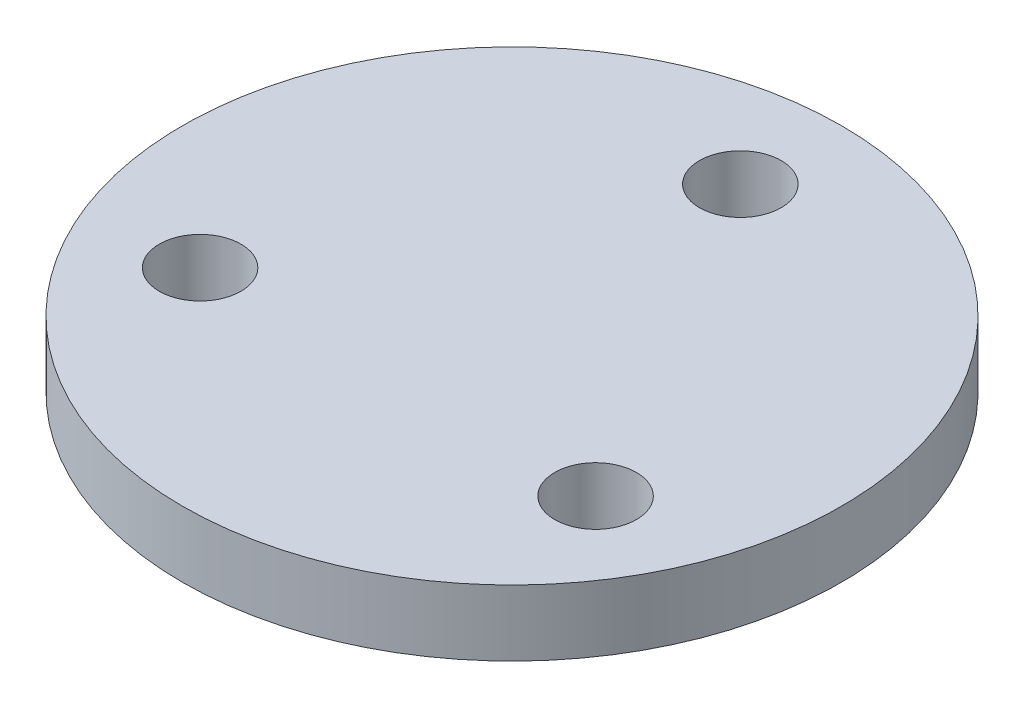
ISO-10303-21;
HEADER;
FILE_DESCRIPTION(('STEP AP214'),'2;1');
FILE_NAME('part.step','',(''),(''),'','','');
FILE_SCHEMA(('AUTOMOTIVE_DESIGN { 1 0 10303 214 1 1 1 1 }'));
ENDSEC;
DATA;
#1=APPLICATION_CONTEXT('core data for automotive mechanical design processes');
#2=APPLICATION_PROTOCOL_DEFINITION('international standard','automotive_design',2000,#1);
#3=PRODUCT_CONTEXT('',#1,'mechanical');
#4=PRODUCT('Part','Part','',(#3));
#5=PRODUCT_RELATED_PRODUCT_CATEGORY('part','',(#4));
#6=PRODUCT_DEFINITION_FORMATION('','',#4);
#7=PRODUCT_DEFINITION_CONTEXT('part definition',#1,'design');
#8=PRODUCT_DEFINITION('design','',#6,#7);
#9=PRODUCT_DEFINITION_SHAPE('','',#8);
#10=(LENGTH_UNIT() NAMED_UNIT(*) SI_UNIT(.MILLI.,.METRE.));
#11=(NAMED_UNIT(*) PLANE_ANGLE_UNIT() SI_UNIT($,.RADIAN.));
#12=(NAMED_UNIT(*) SI_UNIT($,.STERADIAN.) SOLID_ANGLE_UNIT());
#13=UNCERTAINTY_MEASURE_WITH_UNIT(LENGTH_MEASURE(1.E-05),#10,'distance_accuracy_value','');
#14=(GEOMETRIC_REPRESENTATION_CONTEXT(3) GLOBAL_UNCERTAINTY_ASSIGNED_CONTEXT((#13)) GLOBAL_UNIT_ASSIGNED_CONTEXT((#10,
#11,#12)) REPRESENTATION_CONTEXT('',''));
#15=CARTESIAN_POINT('',(0.,0.,0.));
#16=DIRECTION('',(0.,0.,1.));
#17=DIRECTION('',(1.,0.,0.));
#18=AXIS2_PLACEMENT_3D('',#15,#16,#17);
#19=CARTESIAN_POINT('',(0.,6.35,0.));
#20=DIRECTION('',(0.,1.,0.));
#21=DIRECTION('',(0.,0.,1.));
#22=AXIS2_PLACEMENT_3D('',#19,#20,#21);
#23=PLANE('',#22);
#24=CARTESIAN_POINT('',(19.0499999999999,6.35,10.9985226280624));
#25=DIRECTION('',(0.,1.,0.));
#26=DIRECTION('',(0.,0.,1.));
#27=AXIS2_PLACEMENT_3D('',#24,#25,#26);
#28=CIRCLE('',#27,3.937);
#29=CARTESIAN_POINT('',(19.0499999999999,6.35,14.9355226280624));
#30=VERTEX_POINT('',#29);
#31=EDGE_CURVE('E47',#30,#30,#28,.T.);
#32=ORIENTED_EDGE('',*,*,#31,.F.);
#33=EDGE_LOOP('',(#32));
#34=FACE_BOUND('',#33,.T.);
#35=CARTESIAN_POINT('',(0.,6.35,0.));
#36=DIRECTION('',(0.,1.,0.));
#37=DIRECTION('',(0.,0.,1.));
#38=AXIS2_PLACEMENT_3D('',#35,#36,#37);
#39=CIRCLE('',#38,31.75);
#40=CARTESIAN_POINT('',(0.,6.35,31.75));
#41=VERTEX_POINT('',#40);
#42=EDGE_CURVE('E10',#41,#41,#39,.T.);
#43=ORIENTED_EDGE('',*,*,#42,.T.);
#44=EDGE_LOOP('',(#43));
#45=FACE_BOUND('',#44,.T.);
#46=CARTESIAN_POINT('',(0.,6.35,-21.9970452561247));
#47=DIRECTION('',(0.,1.,0.));
#48=DIRECTION('',(0.,0.,1.));
#49=AXIS2_PLACEMENT_3D('',#46,#47,#48);
#50=CIRCLE('',#49,3.937);
#51=CARTESIAN_POINT('',(0.,6.35,-18.0600452561247));
#52=VERTEX_POINT('',#51);
#53=EDGE_CURVE('E42',#52,#52,#50,.T.);
#54=ORIENTED_EDGE('',*,*,#53,.F.);
#55=EDGE_LOOP('',(#54));
#56=FACE_BOUND('',#55,.T.);
#57=CARTESIAN_POINT('',(-19.0500000000001,6.35,10.9985226280622));
#58=DIRECTION('',(0.,1.,0.));
#59=DIRECTION('',(0.,0.,1.));
#60=AXIS2_PLACEMENT_3D('',#57,#58,#59);
#61=CIRCLE('',#60,3.937);
#62=CARTESIAN_POINT('',(-19.0500000000001,6.35,14.9355226280622));
#63=VERTEX_POINT('',#62);
#64=EDGE_CURVE('E53',#63,#63,#61,.T.);
#65=ORIENTED_EDGE('',*,*,#64,.F.);
#66=EDGE_LOOP('',(#65));
#67=FACE_BOUND('',#66,.T.);
#68=ADVANCED_FACE('F31',(#34,#45,#56,#67),#23,.T.);
#69=CARTESIAN_POINT('',(0.,0.,0.));
#70=DIRECTION('',(0.,1.,0.));
#71=DIRECTION('',(0.,0.,1.));
#72=AXIS2_PLACEMENT_3D('',#69,#70,#71);
#73=PLANE('',#72);
#74=CARTESIAN_POINT('',(0.,0.,0.));
#75=DIRECTION('',(0.,1.,0.));
#76=DIRECTION('',(0.,0.,1.));
#77=AXIS2_PLACEMENT_3D('',#74,#75,#76);
#78=CIRCLE('',#77,31.75);
#79=CARTESIAN_POINT('',(0.,0.,31.75));
#80=VERTEX_POINT('',#79);
#81=EDGE_CURVE('E35',#80,#80,#78,.T.);
#82=ORIENTED_EDGE('',*,*,#81,.F.);
#83=EDGE_LOOP('',(#82));
#84=FACE_BOUND('',#83,.T.);
#85=CARTESIAN_POINT('',(0.,0.,-21.9970452561247));
#86=DIRECTION('',(0.,1.,0.));
#87=DIRECTION('',(0.,0.,1.));
#88=AXIS2_PLACEMENT_3D('',#85,#86,#87);
#89=CIRCLE('',#88,3.937);
#90=CARTESIAN_POINT('',(0.,0.,-18.0600452561247));
#91=VERTEX_POINT('',#90);
#92=EDGE_CURVE('E44',#91,#91,#89,.T.);
#93=ORIENTED_EDGE('',*,*,#92,.T.);
#94=EDGE_LOOP('',(#93));
#95=FACE_BOUND('',#94,.T.);
#96=CARTESIAN_POINT('',(19.0499999999999,0.,10.9985226280624));
#97=DIRECTION('',(0.,1.,0.));
#98=DIRECTION('',(0.,0.,1.));
#99=AXIS2_PLACEMENT_3D('',#96,#97,#98);
#100=CIRCLE('',#99,3.937);
#101=CARTESIAN_POINT('',(19.0499999999999,0.,14.9355226280624));
#102=VERTEX_POINT('',#101);
#103=EDGE_CURVE('E50',#102,#102,#100,.T.);
#104=ORIENTED_EDGE('',*,*,#103,.T.);
#105=EDGE_LOOP('',(#104));
#106=FACE_BOUND('',#105,.T.);
#107=CARTESIAN_POINT('',(-19.0500000000001,0.,10.9985226280622));
#108=DIRECTION('',(0.,1.,0.));
#109=DIRECTION('',(0.,0.,1.));
#110=AXIS2_PLACEMENT_3D('',#107,#108,#109);
#111=CIRCLE('',#110,3.937);
#112=CARTESIAN_POINT('',(-19.0500000000001,0.,14.9355226280622));
#113=VERTEX_POINT('',#112);
#114=EDGE_CURVE('E56',#113,#113,#111,.T.);
#115=ORIENTED_EDGE('',*,*,#114,.T.);
#116=EDGE_LOOP('',(#115));
#117=FACE_BOUND('',#116,.T.);
#118=ADVANCED_FACE('F66',(#84,#95,#106,#117),#73,.F.);
#119=CARTESIAN_POINT('',(0.,6.35,0.));
#120=DIRECTION('',(0.,-1.,0.));
#121=DIRECTION('',(0.,0.,-1.));
#122=AXIS2_PLACEMENT_3D('',#119,#120,#121);
#123=CYLINDRICAL_SURFACE('',#122,31.75);
#124=ORIENTED_EDGE('',*,*,#42,.F.);
#125=EDGE_LOOP('',(#124));
#126=FACE_BOUND('',#125,.T.);
#127=ORIENTED_EDGE('',*,*,#81,.T.);
#128=EDGE_LOOP('',(#127));
#129=FACE_BOUND('',#128,.T.);
#130=ADVANCED_FACE('F33',(#126,#129),#123,.T.);
#131=CARTESIAN_POINT('',(0.,6.35,-21.9970452561247));
#132=DIRECTION('',(0.,-1.,0.));
#133=DIRECTION('',(0.,0.,-1.));
#134=AXIS2_PLACEMENT_3D('',#131,#132,#133);
#135=CYLINDRICAL_SURFACE('',#134,3.937);
#136=ORIENTED_EDGE('',*,*,#53,.T.);
#137=EDGE_LOOP('',(#136));
#138=FACE_BOUND('',#137,.T.);
#139=ORIENTED_EDGE('',*,*,#92,.F.);
#140=EDGE_LOOP('',(#139));
#141=FACE_BOUND('',#140,.T.);
#142=ADVANCED_FACE('F75',(#138,#141),#135,.F.);
#143=CARTESIAN_POINT('',(19.0499999999999,6.35,10.9985226280624));
#144=DIRECTION('',(0.,-1.,0.));
#145=DIRECTION('',(0.,0.,-1.));
#146=AXIS2_PLACEMENT_3D('',#143,#144,#145);
#147=CYLINDRICAL_SURFACE('',#146,3.937);
#148=ORIENTED_EDGE('',*,*,#31,.T.);
#149=EDGE_LOOP('',(#148));
#150=FACE_BOUND('',#149,.T.);
#151=ORIENTED_EDGE('',*,*,#103,.F.);
#152=EDGE_LOOP('',(#151));
#153=FACE_BOUND('',#152,.T.);
#154=ADVANCED_FACE('F78',(#150,#153),#147,.F.);
#155=CARTESIAN_POINT('',(-19.0500000000001,6.35,10.9985226280622));
#156=DIRECTION('',(0.,-1.,0.));
#157=DIRECTION('',(0.,0.,-1.));
#158=AXIS2_PLACEMENT_3D('',#155,#156,#157);
#159=CYLINDRICAL_SURFACE('',#158,3.937);
#160=ORIENTED_EDGE('',*,*,#64,.T.);
#161=EDGE_LOOP('',(#160));
#162=FACE_BOUND('',#161,.T.);
#163=ORIENTED_EDGE('',*,*,#114,.F.);
#164=EDGE_LOOP('',(#163));
#165=FACE_BOUND('',#164,.T.);
#166=ADVANCED_FACE('F62',(#162,#165),#159,.F.);
#167=CLOSED_SHELL('',(#68,#118,#130,#142,#154,#166));
#168=MANIFOLD_SOLID_BREP('B2',#167);
#169=ADVANCED_BREP_SHAPE_REPRESENTATION('',(#18,#168),#14);
#170=SHAPE_DEFINITION_REPRESENTATION(#9,#169);
ENDSEC;
END-ISO-10303-21;
